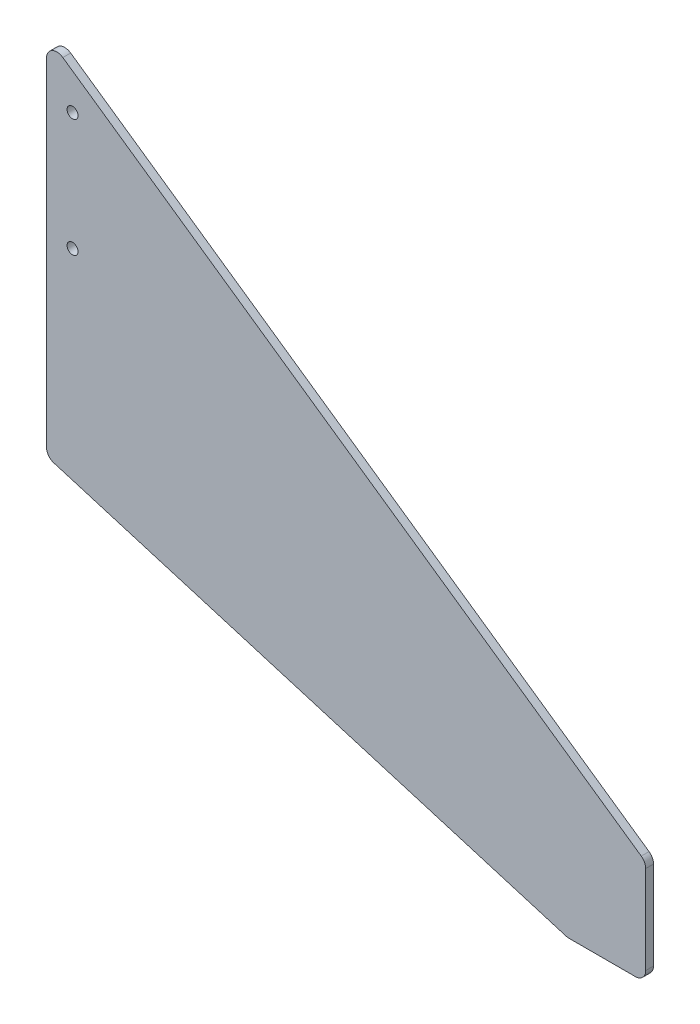
ISO-10303-21;
HEADER;
FILE_DESCRIPTION(('STEP AP214'),'2;1');
FILE_NAME('part.step','',(''),(''),'','','');
FILE_SCHEMA(('AUTOMOTIVE_DESIGN { 1 0 10303 214 1 1 1 1 }'));
ENDSEC;
DATA;
#1=APPLICATION_CONTEXT('core data for automotive mechanical design processes');
#2=APPLICATION_PROTOCOL_DEFINITION('international standard','automotive_design',2000,#1);
#3=PRODUCT_CONTEXT('',#1,'mechanical');
#4=PRODUCT('Part','Part','',(#3));
#5=PRODUCT_RELATED_PRODUCT_CATEGORY('part','',(#4));
#6=PRODUCT_DEFINITION_FORMATION('','',#4);
#7=PRODUCT_DEFINITION_CONTEXT('part definition',#1,'design');
#8=PRODUCT_DEFINITION('design','',#6,#7);
#9=PRODUCT_DEFINITION_SHAPE('','',#8);
#10=(LENGTH_UNIT() NAMED_UNIT(*) SI_UNIT(.MILLI.,.METRE.));
#11=(NAMED_UNIT(*) PLANE_ANGLE_UNIT() SI_UNIT($,.RADIAN.));
#12=(NAMED_UNIT(*) SI_UNIT($,.STERADIAN.) SOLID_ANGLE_UNIT());
#13=UNCERTAINTY_MEASURE_WITH_UNIT(LENGTH_MEASURE(1.E-05),#10,'distance_accuracy_value','');
#14=(GEOMETRIC_REPRESENTATION_CONTEXT(3) GLOBAL_UNCERTAINTY_ASSIGNED_CONTEXT((#13)) GLOBAL_UNIT_ASSIGNED_CONTEXT((#10,
#11,#12)) REPRESENTATION_CONTEXT('',''));
#15=CARTESIAN_POINT('',(0.,0.,0.));
#16=DIRECTION('',(0.,0.,1.));
#17=DIRECTION('',(1.,0.,0.));
#18=AXIS2_PLACEMENT_3D('',#15,#16,#17);
#19=CARTESIAN_POINT('',(200.,-60.,3.));
#20=DIRECTION('',(0.287347885566345,0.957826285221151,0.));
#21=DIRECTION('',(-0.957826285221152,0.287347885566345,0.));
#22=AXIS2_PLACEMENT_3D('',#19,#20,#21);
#23=PLANE('',#22);
#24=DIRECTION('',(0.957826285221151,-0.287347885566345,0.));
#25=VECTOR('',#24,1.);
#26=CARTESIAN_POINT('',(200.,-60.,0.));
#27=LINE('',#26,#25);
#28=CARTESIAN_POINT('',(2.85060845773463,-0.855182537320386,0.));
#29=VERTEX_POINT('',#28);
#30=CARTESIAN_POINT('',(199.437683802949,-59.8313051408846,0.));
#31=VERTEX_POINT('',#30);
#32=EDGE_CURVE('E150',#29,#31,#27,.T.);
#33=ORIENTED_EDGE('',*,*,#32,.T.);
#34=DIRECTION('',(0.,0.,-1.));
#35=VECTOR('',#34,1.);
#36=CARTESIAN_POINT('',(199.437683802949,-59.8313051408846,3.));
#37=LINE('',#36,#35);
#38=CARTESIAN_POINT('',(199.437683802949,-59.8313051408846,3.));
#39=VERTEX_POINT('',#38);
#40=EDGE_CURVE('E128',#31,#39,#37,.F.);
#41=ORIENTED_EDGE('',*,*,#40,.T.);
#42=DIRECTION('',(0.957826285221151,-0.287347885566345,0.));
#43=VECTOR('',#42,1.);
#44=CARTESIAN_POINT('',(200.,-60.,3.));
#45=LINE('',#44,#43);
#46=CARTESIAN_POINT('',(2.85060845773463,-0.855182537320386,3.));
#47=VERTEX_POINT('',#46);
#48=EDGE_CURVE('E163',#47,#39,#45,.T.);
#49=ORIENTED_EDGE('',*,*,#48,.F.);
#50=DIRECTION('',(0.,0.,-1.));
#51=VECTOR('',#50,1.);
#52=CARTESIAN_POINT('',(2.8506084577346,-0.855182537320379,3.));
#53=LINE('',#52,#51);
#54=EDGE_CURVE('E133',#47,#29,#53,.T.);
#55=ORIENTED_EDGE('',*,*,#54,.T.);
#56=EDGE_LOOP('',(#33,#41,#49,#55));
#57=FACE_BOUND('',#56,.T.);
#58=ADVANCED_FACE('F46',(#57),#23,.F.);
#59=CARTESIAN_POINT('',(230.,-60.,3.));
#60=DIRECTION('',(0.,1.,0.));
#61=DIRECTION('',(-1.,0.,0.));
#62=AXIS2_PLACEMENT_3D('',#59,#60,#61);
#63=PLANE('',#62);
#64=DIRECTION('',(1.,0.,0.));
#65=VECTOR('',#64,1.);
#66=CARTESIAN_POINT('',(230.,-60.,3.));
#67=LINE('',#66,#65);
#68=CARTESIAN_POINT('',(200.587075345214,-60.,3.));
#69=VERTEX_POINT('',#68);
#70=CARTESIAN_POINT('',(226.,-60.,3.));
#71=VERTEX_POINT('',#70);
#72=EDGE_CURVE('E143',#69,#71,#67,.T.);
#73=ORIENTED_EDGE('',*,*,#72,.F.);
#74=DIRECTION('',(0.,0.,-1.));
#75=VECTOR('',#74,1.);
#76=CARTESIAN_POINT('',(200.587075345214,-60.,3.));
#77=LINE('',#76,#75);
#78=CARTESIAN_POINT('',(200.587075345214,-60.,0.));
#79=VERTEX_POINT('',#78);
#80=EDGE_CURVE('E127',#69,#79,#77,.T.);
#81=ORIENTED_EDGE('',*,*,#80,.T.);
#82=DIRECTION('',(1.,0.,0.));
#83=VECTOR('',#82,1.);
#84=CARTESIAN_POINT('',(230.,-60.,0.));
#85=LINE('',#84,#83);
#86=CARTESIAN_POINT('',(226.,-60.,0.));
#87=VERTEX_POINT('',#86);
#88=EDGE_CURVE('E140',#79,#87,#85,.T.);
#89=ORIENTED_EDGE('',*,*,#88,.T.);
#90=DIRECTION('',(0.,0.,-1.));
#91=VECTOR('',#90,1.);
#92=CARTESIAN_POINT('',(226.,-60.,3.));
#93=LINE('',#92,#91);
#94=EDGE_CURVE('E145',#87,#71,#93,.F.);
#95=ORIENTED_EDGE('',*,*,#94,.T.);
#96=EDGE_LOOP('',(#73,#81,#89,#95));
#97=FACE_BOUND('',#96,.T.);
#98=ADVANCED_FACE('F139',(#97),#63,.F.);
#99=CARTESIAN_POINT('',(230.,-20.,3.));
#100=DIRECTION('',(-1.,0.,0.));
#101=DIRECTION('',(0.,0.,1.));
#102=AXIS2_PLACEMENT_3D('',#99,#100,#101);
#103=PLANE('',#102);
#104=DIRECTION('',(0.,1.,0.));
#105=VECTOR('',#104,1.);
#106=CARTESIAN_POINT('',(230.,-20.,3.));
#107=LINE('',#106,#105);
#108=CARTESIAN_POINT('',(230.,-56.,3.));
#109=VERTEX_POINT('',#108);
#110=CARTESIAN_POINT('',(230.,-22.0900611221294,3.));
#111=VERTEX_POINT('',#110);
#112=EDGE_CURVE('E213',#109,#111,#107,.T.);
#113=ORIENTED_EDGE('',*,*,#112,.F.);
#114=DIRECTION('',(0.,0.,-1.));
#115=VECTOR('',#114,1.);
#116=CARTESIAN_POINT('',(230.,-56.,3.));
#117=LINE('',#116,#115);
#118=CARTESIAN_POINT('',(230.,-56.,0.));
#119=VERTEX_POINT('',#118);
#120=EDGE_CURVE('E192',#109,#119,#117,.T.);
#121=ORIENTED_EDGE('',*,*,#120,.T.);
#122=DIRECTION('',(0.,1.,0.));
#123=VECTOR('',#122,1.);
#124=CARTESIAN_POINT('',(230.,-20.,0.));
#125=LINE('',#124,#123);
#126=CARTESIAN_POINT('',(230.,-22.0900611221294,0.));
#127=VERTEX_POINT('',#126);
#128=EDGE_CURVE('E149',#119,#127,#125,.T.);
#129=ORIENTED_EDGE('',*,*,#128,.T.);
#130=DIRECTION('',(0.,0.,-1.));
#131=VECTOR('',#130,1.);
#132=CARTESIAN_POINT('',(230.,-22.0900611221294,3.));
#133=LINE('',#132,#131);
#134=EDGE_CURVE('E190',#127,#111,#133,.F.);
#135=ORIENTED_EDGE('',*,*,#134,.T.);
#136=EDGE_LOOP('',(#113,#121,#129,#135));
#137=FACE_BOUND('',#136,.T.);
#138=ADVANCED_FACE('F243',(#137),#103,.F.);
#139=CARTESIAN_POINT('',(0.,140.,3.));
#140=DIRECTION('',(-0.5710644881986,-0.820905201785487,0.));
#141=DIRECTION('',(0.820905201785487,-0.5710644881986,0.));
#142=AXIS2_PLACEMENT_3D('',#139,#140,#141);
#143=PLANE('',#142);
#144=DIRECTION('',(-0.820905201785487,0.5710644881986,0.));
#145=VECTOR('',#144,1.);
#146=CARTESIAN_POINT('',(0.,140.,3.));
#147=LINE('',#146,#145);
#148=CARTESIAN_POINT('',(228.284257952794,-18.8064403149874,3.));
#149=VERTEX_POINT('',#148);
#150=CARTESIAN_POINT('',(6.28425795279439,135.628342293708,3.));
#151=VERTEX_POINT('',#150);
#152=EDGE_CURVE('E221',#149,#151,#147,.T.);
#153=ORIENTED_EDGE('',*,*,#152,.F.);
#154=DIRECTION('',(0.,0.,-1.));
#155=VECTOR('',#154,1.);
#156=CARTESIAN_POINT('',(228.284257952794,-18.8064403149874,3.));
#157=LINE('',#156,#155);
#158=CARTESIAN_POINT('',(228.284257952794,-18.8064403149874,0.));
#159=VERTEX_POINT('',#158);
#160=EDGE_CURVE('E197',#149,#159,#157,.T.);
#161=ORIENTED_EDGE('',*,*,#160,.T.);
#162=DIRECTION('',(-0.820905201785487,0.5710644881986,0.));
#163=VECTOR('',#162,1.);
#164=CARTESIAN_POINT('',(0.,140.,0.));
#165=LINE('',#164,#163);
#166=CARTESIAN_POINT('',(6.28425795279439,135.628342293708,0.));
#167=VERTEX_POINT('',#166);
#168=EDGE_CURVE('E153',#159,#167,#165,.T.);
#169=ORIENTED_EDGE('',*,*,#168,.T.);
#170=DIRECTION('',(0.,0.,-1.));
#171=VECTOR('',#170,1.);
#172=CARTESIAN_POINT('',(6.28425795279439,135.628342293708,3.));
#173=LINE('',#172,#171);
#174=EDGE_CURVE('E195',#167,#151,#173,.F.);
#175=ORIENTED_EDGE('',*,*,#174,.T.);
#176=EDGE_LOOP('',(#153,#161,#169,#175));
#177=FACE_BOUND('',#176,.T.);
#178=ADVANCED_FACE('F233',(#177),#143,.F.);
#179=CARTESIAN_POINT('',(0.,0.,3.));
#180=DIRECTION('',(1.,0.,0.));
#181=DIRECTION('',(0.,0.,-1.));
#182=AXIS2_PLACEMENT_3D('',#179,#180,#181);
#183=PLANE('',#182);
#184=DIRECTION('',(0.,-1.,0.));
#185=VECTOR('',#184,1.);
#186=CARTESIAN_POINT('',(0.,0.,0.));
#187=LINE('',#186,#185);
#188=CARTESIAN_POINT('',(0.,132.344721486566,0.));
#189=VERTEX_POINT('',#188);
#190=CARTESIAN_POINT('',(0.,2.97612260356422,0.));
#191=VERTEX_POINT('',#190);
#192=EDGE_CURVE('E161',#189,#191,#187,.T.);
#193=ORIENTED_EDGE('',*,*,#192,.T.);
#194=DIRECTION('',(0.,0.,-1.));
#195=VECTOR('',#194,1.);
#196=CARTESIAN_POINT('',(0.,2.97612260356422,3.));
#197=LINE('',#196,#195);
#198=CARTESIAN_POINT('',(0.,2.97612260356422,3.));
#199=VERTEX_POINT('',#198);
#200=EDGE_CURVE('E11',#191,#199,#197,.F.);
#201=ORIENTED_EDGE('',*,*,#200,.T.);
#202=DIRECTION('',(0.,-1.,0.));
#203=VECTOR('',#202,1.);
#204=CARTESIAN_POINT('',(0.,0.,3.));
#205=LINE('',#204,#203);
#206=CARTESIAN_POINT('',(0.,132.344721486566,3.));
#207=VERTEX_POINT('',#206);
#208=EDGE_CURVE('E170',#207,#199,#205,.T.);
#209=ORIENTED_EDGE('',*,*,#208,.F.);
#210=DIRECTION('',(0.,0.,-1.));
#211=VECTOR('',#210,1.);
#212=CARTESIAN_POINT('',(0.,132.344721486566,3.));
#213=LINE('',#212,#211);
#214=EDGE_CURVE('E54',#207,#189,#213,.T.);
#215=ORIENTED_EDGE('',*,*,#214,.T.);
#216=EDGE_LOOP('',(#193,#201,#209,#215));
#217=FACE_BOUND('',#216,.T.);
#218=ADVANCED_FACE('F202',(#217),#183,.F.);
#219=CARTESIAN_POINT('',(0.,0.,3.));
#220=DIRECTION('',(0.,0.,-1.));
#221=DIRECTION('',(-1.,0.,0.));
#222=AXIS2_PLACEMENT_3D('',#219,#220,#221);
#223=PLANE('',#222);
#224=CARTESIAN_POINT('',(10.,74.,3.));
#225=DIRECTION('',(0.,0.,1.));
#226=DIRECTION('',(1.,0.,0.));
#227=AXIS2_PLACEMENT_3D('',#224,#225,#226);
#228=CIRCLE('',#227,2.1);
#229=CARTESIAN_POINT('',(12.1,74.,3.));
#230=VERTEX_POINT('',#229);
#231=EDGE_CURVE('E167',#230,#230,#228,.T.);
#232=ORIENTED_EDGE('',*,*,#231,.F.);
#233=EDGE_LOOP('',(#232));
#234=FACE_BOUND('',#233,.T.);
#235=CARTESIAN_POINT('',(10.,119.2,3.));
#236=DIRECTION('',(0.,0.,1.));
#237=DIRECTION('',(1.,0.,0.));
#238=AXIS2_PLACEMENT_3D('',#235,#236,#237);
#239=CIRCLE('',#238,2.1);
#240=CARTESIAN_POINT('',(12.1,119.2,3.));
#241=VERTEX_POINT('',#240);
#242=EDGE_CURVE('E216',#241,#241,#239,.T.);
#243=ORIENTED_EDGE('',*,*,#242,.F.);
#244=EDGE_LOOP('',(#243));
#245=FACE_BOUND('',#244,.T.);
#246=ORIENTED_EDGE('',*,*,#48,.T.);
#247=CARTESIAN_POINT('',(200.587075345214,-56.,3.));
#248=DIRECTION('',(0.,0.,-1.));
#249=DIRECTION('',(-1.,0.,0.));
#250=AXIS2_PLACEMENT_3D('',#247,#248,#249);
#251=CIRCLE('',#250,4.);
#252=EDGE_CURVE('E188',#39,#69,#251,.F.);
#253=ORIENTED_EDGE('',*,*,#252,.T.);
#254=ORIENTED_EDGE('',*,*,#72,.T.);
#255=CARTESIAN_POINT('',(226.,-56.,3.));
#256=DIRECTION('',(0.,0.,-1.));
#257=DIRECTION('',(-1.,0.,0.));
#258=AXIS2_PLACEMENT_3D('',#255,#256,#257);
#259=CIRCLE('',#258,4.);
#260=EDGE_CURVE('E186',#71,#109,#259,.F.);
#261=ORIENTED_EDGE('',*,*,#260,.T.);
#262=ORIENTED_EDGE('',*,*,#112,.T.);
#263=CARTESIAN_POINT('',(226.,-22.0900611221294,3.));
#264=DIRECTION('',(0.,0.,-1.));
#265=DIRECTION('',(-1.,0.,0.));
#266=AXIS2_PLACEMENT_3D('',#263,#264,#265);
#267=CIRCLE('',#266,4.);
#268=EDGE_CURVE('E184',#111,#149,#267,.F.);
#269=ORIENTED_EDGE('',*,*,#268,.T.);
#270=ORIENTED_EDGE('',*,*,#152,.T.);
#271=CARTESIAN_POINT('',(4.,132.344721486566,3.));
#272=DIRECTION('',(0.,0.,-1.));
#273=DIRECTION('',(-1.,0.,0.));
#274=AXIS2_PLACEMENT_3D('',#271,#272,#273);
#275=CIRCLE('',#274,4.);
#276=EDGE_CURVE('E66',#151,#207,#275,.F.);
#277=ORIENTED_EDGE('',*,*,#276,.T.);
#278=ORIENTED_EDGE('',*,*,#208,.T.);
#279=CARTESIAN_POINT('',(4.,2.97612260356422,3.));
#280=DIRECTION('',(0.,0.,-1.));
#281=DIRECTION('',(-1.,0.,0.));
#282=AXIS2_PLACEMENT_3D('',#279,#280,#281);
#283=CIRCLE('',#282,4.);
#284=EDGE_CURVE('E182',#199,#47,#283,.F.);
#285=ORIENTED_EDGE('',*,*,#284,.T.);
#286=EDGE_LOOP('',(#246,#253,#254,#261,#262,#269,#270,#277,#278,#285));
#287=FACE_BOUND('',#286,.T.);
#288=ADVANCED_FACE('F222',(#234,#245,#287),#223,.F.);
#289=CARTESIAN_POINT('',(0.,0.,0.));
#290=DIRECTION('',(0.,0.,-1.));
#291=DIRECTION('',(-1.,0.,0.));
#292=AXIS2_PLACEMENT_3D('',#289,#290,#291);
#293=PLANE('',#292);
#294=CARTESIAN_POINT('',(10.,74.,0.));
#295=DIRECTION('',(0.,0.,-1.));
#296=DIRECTION('',(-1.,0.,0.));
#297=AXIS2_PLACEMENT_3D('',#294,#295,#296);
#298=CIRCLE('',#297,2.1);
#299=CARTESIAN_POINT('',(7.9,74.,0.));
#300=VERTEX_POINT('',#299);
#301=EDGE_CURVE('E155',#300,#300,#298,.T.);
#302=ORIENTED_EDGE('',*,*,#301,.F.);
#303=EDGE_LOOP('',(#302));
#304=FACE_BOUND('',#303,.T.);
#305=CARTESIAN_POINT('',(10.,119.2,0.));
#306=DIRECTION('',(0.,0.,-1.));
#307=DIRECTION('',(-1.,0.,0.));
#308=AXIS2_PLACEMENT_3D('',#305,#306,#307);
#309=CIRCLE('',#308,2.1);
#310=CARTESIAN_POINT('',(7.9,119.2,0.));
#311=VERTEX_POINT('',#310);
#312=EDGE_CURVE('E164',#311,#311,#309,.T.);
#313=ORIENTED_EDGE('',*,*,#312,.F.);
#314=EDGE_LOOP('',(#313));
#315=FACE_BOUND('',#314,.T.);
#316=ORIENTED_EDGE('',*,*,#88,.F.);
#317=CARTESIAN_POINT('',(200.587075345214,-56.,0.));
#318=DIRECTION('',(0.,0.,-1.));
#319=DIRECTION('',(-1.,0.,0.));
#320=AXIS2_PLACEMENT_3D('',#317,#318,#319);
#321=CIRCLE('',#320,4.);
#322=EDGE_CURVE('E123',#79,#31,#321,.T.);
#323=ORIENTED_EDGE('',*,*,#322,.T.);
#324=ORIENTED_EDGE('',*,*,#32,.F.);
#325=CARTESIAN_POINT('',(4.,2.97612260356422,0.));
#326=DIRECTION('',(0.,0.,-1.));
#327=DIRECTION('',(-1.,0.,0.));
#328=AXIS2_PLACEMENT_3D('',#325,#326,#327);
#329=CIRCLE('',#328,4.);
#330=EDGE_CURVE('E173',#29,#191,#329,.T.);
#331=ORIENTED_EDGE('',*,*,#330,.T.);
#332=ORIENTED_EDGE('',*,*,#192,.F.);
#333=CARTESIAN_POINT('',(4.,132.344721486566,0.));
#334=DIRECTION('',(0.,0.,-1.));
#335=DIRECTION('',(-1.,0.,0.));
#336=AXIS2_PLACEMENT_3D('',#333,#334,#335);
#337=CIRCLE('',#336,4.);
#338=EDGE_CURVE('E144',#189,#167,#337,.T.);
#339=ORIENTED_EDGE('',*,*,#338,.T.);
#340=ORIENTED_EDGE('',*,*,#168,.F.);
#341=CARTESIAN_POINT('',(226.,-22.0900611221294,0.));
#342=DIRECTION('',(0.,0.,-1.));
#343=DIRECTION('',(-1.,0.,0.));
#344=AXIS2_PLACEMENT_3D('',#341,#342,#343);
#345=CIRCLE('',#344,4.);
#346=EDGE_CURVE('E175',#159,#127,#345,.T.);
#347=ORIENTED_EDGE('',*,*,#346,.T.);
#348=ORIENTED_EDGE('',*,*,#128,.F.);
#349=CARTESIAN_POINT('',(226.,-56.,0.));
#350=DIRECTION('',(0.,0.,-1.));
#351=DIRECTION('',(-1.,0.,0.));
#352=AXIS2_PLACEMENT_3D('',#349,#350,#351);
#353=CIRCLE('',#352,4.);
#354=EDGE_CURVE('E134',#119,#87,#353,.T.);
#355=ORIENTED_EDGE('',*,*,#354,.T.);
#356=EDGE_LOOP('',(#316,#323,#324,#331,#332,#339,#340,#347,#348,#355));
#357=FACE_BOUND('',#356,.T.);
#358=ADVANCED_FACE('F147',(#304,#315,#357),#293,.T.);
#359=CARTESIAN_POINT('',(10.,119.2,-36.));
#360=DIRECTION('',(0.,0.,1.));
#361=DIRECTION('',(1.,0.,0.));
#362=AXIS2_PLACEMENT_3D('',#359,#360,#361);
#363=CYLINDRICAL_SURFACE('',#362,2.1);
#364=ORIENTED_EDGE('',*,*,#312,.T.);
#365=EDGE_LOOP('',(#364));
#366=FACE_BOUND('',#365,.T.);
#367=ORIENTED_EDGE('',*,*,#242,.T.);
#368=EDGE_LOOP('',(#367));
#369=FACE_BOUND('',#368,.T.);
#370=ADVANCED_FACE('F230',(#366,#369),#363,.F.);
#371=CARTESIAN_POINT('',(10.,74.,-36.));
#372=DIRECTION('',(0.,0.,1.));
#373=DIRECTION('',(1.,0.,0.));
#374=AXIS2_PLACEMENT_3D('',#371,#372,#373);
#375=CYLINDRICAL_SURFACE('',#374,2.1);
#376=ORIENTED_EDGE('',*,*,#301,.T.);
#377=EDGE_LOOP('',(#376));
#378=FACE_BOUND('',#377,.T.);
#379=ORIENTED_EDGE('',*,*,#231,.T.);
#380=EDGE_LOOP('',(#379));
#381=FACE_BOUND('',#380,.T.);
#382=ADVANCED_FACE('F250',(#378,#381),#375,.F.);
#383=CARTESIAN_POINT('',(200.587075345214,-56.,3.));
#384=DIRECTION('',(0.,0.,-1.));
#385=DIRECTION('',(-1.,0.,0.));
#386=AXIS2_PLACEMENT_3D('',#383,#384,#385);
#387=CYLINDRICAL_SURFACE('',#386,4.);
#388=ORIENTED_EDGE('',*,*,#252,.F.);
#389=ORIENTED_EDGE('',*,*,#40,.F.);
#390=ORIENTED_EDGE('',*,*,#322,.F.);
#391=ORIENTED_EDGE('',*,*,#80,.F.);
#392=EDGE_LOOP('',(#388,#389,#390,#391));
#393=FACE_BOUND('',#392,.T.);
#394=ADVANCED_FACE('F126',(#393),#387,.T.);
#395=CARTESIAN_POINT('',(226.,-56.,3.));
#396=DIRECTION('',(0.,0.,-1.));
#397=DIRECTION('',(-1.,0.,0.));
#398=AXIS2_PLACEMENT_3D('',#395,#396,#397);
#399=CYLINDRICAL_SURFACE('',#398,4.);
#400=ORIENTED_EDGE('',*,*,#260,.F.);
#401=ORIENTED_EDGE('',*,*,#94,.F.);
#402=ORIENTED_EDGE('',*,*,#354,.F.);
#403=ORIENTED_EDGE('',*,*,#120,.F.);
#404=EDGE_LOOP('',(#400,#401,#402,#403));
#405=FACE_BOUND('',#404,.T.);
#406=ADVANCED_FACE('F249',(#405),#399,.T.);
#407=CARTESIAN_POINT('',(226.,-22.0900611221294,3.));
#408=DIRECTION('',(0.,0.,-1.));
#409=DIRECTION('',(-1.,0.,0.));
#410=AXIS2_PLACEMENT_3D('',#407,#408,#409);
#411=CYLINDRICAL_SURFACE('',#410,4.);
#412=ORIENTED_EDGE('',*,*,#268,.F.);
#413=ORIENTED_EDGE('',*,*,#134,.F.);
#414=ORIENTED_EDGE('',*,*,#346,.F.);
#415=ORIENTED_EDGE('',*,*,#160,.F.);
#416=EDGE_LOOP('',(#412,#413,#414,#415));
#417=FACE_BOUND('',#416,.T.);
#418=ADVANCED_FACE('F253',(#417),#411,.T.);
#419=CARTESIAN_POINT('',(4.,2.97612260356422,3.));
#420=DIRECTION('',(0.,0.,-1.));
#421=DIRECTION('',(-1.,0.,0.));
#422=AXIS2_PLACEMENT_3D('',#419,#420,#421);
#423=CYLINDRICAL_SURFACE('',#422,4.);
#424=ORIENTED_EDGE('',*,*,#284,.F.);
#425=ORIENTED_EDGE('',*,*,#200,.F.);
#426=ORIENTED_EDGE('',*,*,#330,.F.);
#427=ORIENTED_EDGE('',*,*,#54,.F.);
#428=EDGE_LOOP('',(#424,#425,#426,#427));
#429=FACE_BOUND('',#428,.T.);
#430=ADVANCED_FACE('F208',(#429),#423,.T.);
#431=CARTESIAN_POINT('',(4.,132.344721486566,3.));
#432=DIRECTION('',(0.,0.,-1.));
#433=DIRECTION('',(-1.,0.,0.));
#434=AXIS2_PLACEMENT_3D('',#431,#432,#433);
#435=CYLINDRICAL_SURFACE('',#434,4.);
#436=ORIENTED_EDGE('',*,*,#276,.F.);
#437=ORIENTED_EDGE('',*,*,#174,.F.);
#438=ORIENTED_EDGE('',*,*,#338,.F.);
#439=ORIENTED_EDGE('',*,*,#214,.F.);
#440=EDGE_LOOP('',(#436,#437,#438,#439));
#441=FACE_BOUND('',#440,.T.);
#442=ADVANCED_FACE('F48',(#441),#435,.T.);
#443=CLOSED_SHELL('',(#58,#98,#138,#178,#218,#288,#358,#370,#382,#394,#406,#418,#430,#442));
#444=MANIFOLD_SOLID_BREP('B2',#443);
#445=ADVANCED_BREP_SHAPE_REPRESENTATION('',(#18,#444),#14);
#446=SHAPE_DEFINITION_REPRESENTATION(#9,#445);
ENDSEC;
END-ISO-10303-21;
